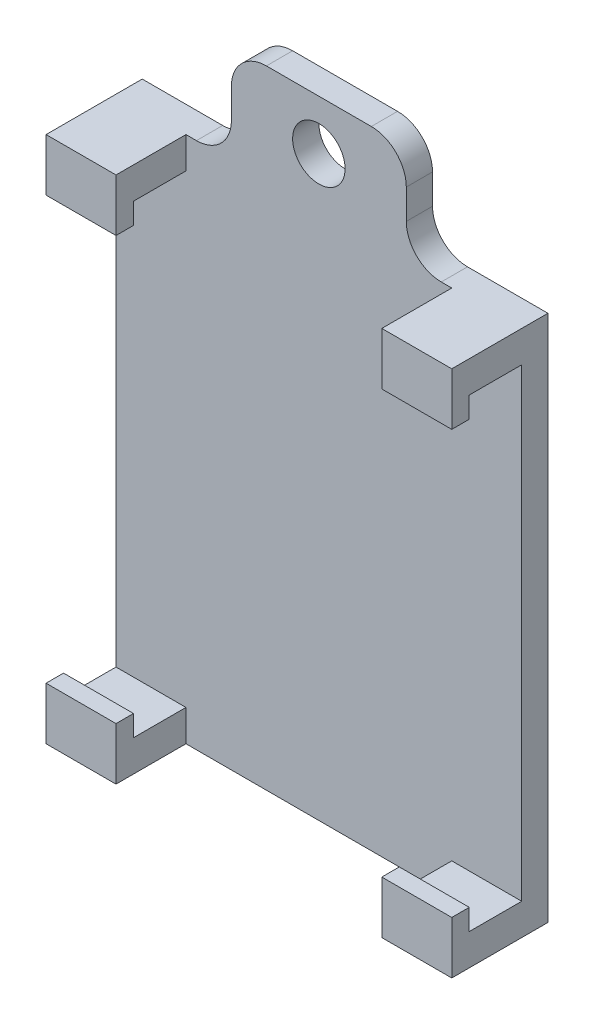
ISO-10303-21;
HEADER;
FILE_DESCRIPTION(('STEP AP214'),'2;1');
FILE_NAME('part.step','',(''),(''),'','','');
FILE_SCHEMA(('AUTOMOTIVE_DESIGN { 1 0 10303 214 1 1 1 1 }'));
ENDSEC;
DATA;
#1=APPLICATION_CONTEXT('core data for automotive mechanical design processes');
#2=APPLICATION_PROTOCOL_DEFINITION('international standard','automotive_design',2000,#1);
#3=PRODUCT_CONTEXT('',#1,'mechanical');
#4=PRODUCT('Part','Part','',(#3));
#5=PRODUCT_RELATED_PRODUCT_CATEGORY('part','',(#4));
#6=PRODUCT_DEFINITION_FORMATION('','',#4);
#7=PRODUCT_DEFINITION_CONTEXT('part definition',#1,'design');
#8=PRODUCT_DEFINITION('design','',#6,#7);
#9=PRODUCT_DEFINITION_SHAPE('','',#8);
#10=(LENGTH_UNIT() NAMED_UNIT(*) SI_UNIT(.MILLI.,.METRE.));
#11=(NAMED_UNIT(*) PLANE_ANGLE_UNIT() SI_UNIT($,.RADIAN.));
#12=(NAMED_UNIT(*) SI_UNIT($,.STERADIAN.) SOLID_ANGLE_UNIT());
#13=UNCERTAINTY_MEASURE_WITH_UNIT(LENGTH_MEASURE(1.E-05),#10,'distance_accuracy_value','');
#14=(GEOMETRIC_REPRESENTATION_CONTEXT(3) GLOBAL_UNCERTAINTY_ASSIGNED_CONTEXT((#13)) GLOBAL_UNIT_ASSIGNED_CONTEXT((#10,
#11,#12)) REPRESENTATION_CONTEXT('',''));
#15=CARTESIAN_POINT('',(0.,0.,0.));
#16=DIRECTION('',(0.,0.,1.));
#17=DIRECTION('',(1.,0.,0.));
#18=AXIS2_PLACEMENT_3D('',#15,#16,#17);
#19=CARTESIAN_POINT('',(0.,14.92,-17.95));
#20=DIRECTION('',(0.,1.,0.));
#21=DIRECTION('',(-1.,0.,0.));
#22=AXIS2_PLACEMENT_3D('',#19,#20,#21);
#23=PLANE('',#22);
#24=DIRECTION('',(-1.,0.,0.));
#25=VECTOR('',#24,1.);
#26=CARTESIAN_POINT('',(0.,14.92,-18.95));
#27=LINE('',#26,#25);
#28=CARTESIAN_POINT('',(4.,14.92,-18.95));
#29=VERTEX_POINT('',#28);
#30=CARTESIAN_POINT('',(0.,14.92,-18.95));
#31=VERTEX_POINT('',#30);
#32=EDGE_CURVE('E446',#29,#31,#27,.T.);
#33=ORIENTED_EDGE('',*,*,#32,.F.);
#34=DIRECTION('',(0.,0.,1.));
#35=VECTOR('',#34,1.);
#36=CARTESIAN_POINT('',(4.,14.92,-17.95));
#37=LINE('',#36,#35);
#38=CARTESIAN_POINT('',(4.,14.92,-17.95));
#39=VERTEX_POINT('',#38);
#40=EDGE_CURVE('E412',#29,#39,#37,.T.);
#41=ORIENTED_EDGE('',*,*,#40,.T.);
#42=DIRECTION('',(1.,0.,0.));
#43=VECTOR('',#42,1.);
#44=CARTESIAN_POINT('',(0.,14.92,-17.95));
#45=LINE('',#44,#43);
#46=CARTESIAN_POINT('',(0.,14.92,-17.95));
#47=VERTEX_POINT('',#46);
#48=EDGE_CURVE('E494',#47,#39,#45,.T.);
#49=ORIENTED_EDGE('',*,*,#48,.F.);
#50=DIRECTION('',(0.,0.,-1.));
#51=VECTOR('',#50,1.);
#52=CARTESIAN_POINT('',(0.,14.92,-17.95));
#53=LINE('',#52,#51);
#54=EDGE_CURVE('E282',#47,#31,#53,.T.);
#55=ORIENTED_EDGE('',*,*,#54,.T.);
#56=EDGE_LOOP('',(#33,#41,#49,#55));
#57=FACE_BOUND('',#56,.T.);
#58=ADVANCED_FACE('F40',(#57),#23,.F.);
#59=CARTESIAN_POINT('',(0.,17.92,-17.95));
#60=DIRECTION('',(0.,-1.,0.));
#61=DIRECTION('',(1.,0.,0.));
#62=AXIS2_PLACEMENT_3D('',#59,#60,#61);
#63=PLANE('',#62);
#64=DIRECTION('',(1.,0.,0.));
#65=VECTOR('',#64,1.);
#66=CARTESIAN_POINT('',(0.,17.92,-21.9499999999999));
#67=LINE('',#66,#65);
#68=CARTESIAN_POINT('',(4.,17.92,-21.9499999999999));
#69=VERTEX_POINT('',#68);
#70=CARTESIAN_POINT('',(4.6,17.92,-21.9499999999999));
#71=VERTEX_POINT('',#70);
#72=EDGE_CURVE('E354',#69,#71,#67,.T.);
#73=ORIENTED_EDGE('',*,*,#72,.T.);
#74=DIRECTION('',(0.,0.,1.));
#75=VECTOR('',#74,1.);
#76=CARTESIAN_POINT('',(4.6,17.92,-23.4499999999999));
#77=LINE('',#76,#75);
#78=CARTESIAN_POINT('',(4.6,17.92,-23.4499999999999));
#79=VERTEX_POINT('',#78);
#80=EDGE_CURVE('E269',#71,#79,#77,.F.);
#81=ORIENTED_EDGE('',*,*,#80,.T.);
#82=DIRECTION('',(1.,0.,0.));
#83=VECTOR('',#82,1.);
#84=CARTESIAN_POINT('',(0.,17.92,-23.4499999999999));
#85=LINE('',#84,#83);
#86=CARTESIAN_POINT('',(0.,17.92,-23.4499999999999));
#87=VERTEX_POINT('',#86);
#88=EDGE_CURVE('E265',#87,#79,#85,.T.);
#89=ORIENTED_EDGE('',*,*,#88,.F.);
#90=DIRECTION('',(0.,0.,-1.));
#91=VECTOR('',#90,1.);
#92=CARTESIAN_POINT('',(0.,17.92,-17.95));
#93=LINE('',#92,#91);
#94=CARTESIAN_POINT('',(0.,17.92,-17.95));
#95=VERTEX_POINT('',#94);
#96=EDGE_CURVE('E249',#95,#87,#93,.T.);
#97=ORIENTED_EDGE('',*,*,#96,.F.);
#98=DIRECTION('',(-1.,0.,0.));
#99=VECTOR('',#98,1.);
#100=CARTESIAN_POINT('',(0.,17.92,-17.95));
#101=LINE('',#100,#99);
#102=CARTESIAN_POINT('',(4.,17.92,-17.95));
#103=VERTEX_POINT('',#102);
#104=EDGE_CURVE('E499',#103,#95,#101,.T.);
#105=ORIENTED_EDGE('',*,*,#104,.F.);
#106=DIRECTION('',(0.,0.,-1.));
#107=VECTOR('',#106,1.);
#108=CARTESIAN_POINT('',(4.,17.92,-17.9499999999999));
#109=LINE('',#108,#107);
#110=EDGE_CURVE('E415',#103,#69,#109,.T.);
#111=ORIENTED_EDGE('',*,*,#110,.T.);
#112=EDGE_LOOP('',(#73,#81,#89,#97,#105,#111));
#113=FACE_BOUND('',#112,.T.);
#114=ADVANCED_FACE('F267',(#113),#63,.F.);
#115=CARTESIAN_POINT('',(0.,-17.95,-17.9500000000001));
#116=DIRECTION('',(0.,0.,-1.));
#117=DIRECTION('',(0.,1.,0.));
#118=AXIS2_PLACEMENT_3D('',#115,#116,#117);
#119=PLANE('',#118);
#120=ORIENTED_EDGE('',*,*,#48,.T.);
#121=DIRECTION('',(0.,-1.,0.));
#122=VECTOR('',#121,1.);
#123=CARTESIAN_POINT('',(4.,23.62,-17.9499999999999));
#124=LINE('',#123,#122);
#125=EDGE_CURVE('E373',#103,#39,#124,.T.);
#126=ORIENTED_EDGE('',*,*,#125,.F.);
#127=ORIENTED_EDGE('',*,*,#104,.T.);
#128=DIRECTION('',(0.,-1.,0.));
#129=VECTOR('',#128,1.);
#130=CARTESIAN_POINT('',(0.,14.92,-17.95));
#131=LINE('',#130,#129);
#132=EDGE_CURVE('E258',#95,#47,#131,.T.);
#133=ORIENTED_EDGE('',*,*,#132,.T.);
#134=EDGE_LOOP('',(#120,#126,#127,#133));
#135=FACE_BOUND('',#134,.T.);
#136=ADVANCED_FACE('F539',(#135),#119,.F.);
#137=CARTESIAN_POINT('',(0.,-9.25000000000001,-17.95));
#138=DIRECTION('',(0.,-1.,0.));
#139=DIRECTION('',(1.,0.,0.));
#140=AXIS2_PLACEMENT_3D('',#137,#138,#139);
#141=PLANE('',#140);
#142=DIRECTION('',(-1.,0.,0.));
#143=VECTOR('',#142,1.);
#144=CARTESIAN_POINT('',(0.,-9.25000000000001,-17.95));
#145=LINE('',#144,#143);
#146=CARTESIAN_POINT('',(4.,-9.25000000000001,-17.95));
#147=VERTEX_POINT('',#146);
#148=CARTESIAN_POINT('',(0.,-9.25000000000001,-17.95));
#149=VERTEX_POINT('',#148);
#150=EDGE_CURVE('E478',#147,#149,#145,.T.);
#151=ORIENTED_EDGE('',*,*,#150,.F.);
#152=DIRECTION('',(0.,0.,-1.));
#153=VECTOR('',#152,1.);
#154=CARTESIAN_POINT('',(4.,-9.25000000000001,-17.95));
#155=LINE('',#154,#153);
#156=CARTESIAN_POINT('',(4.,-9.25,-18.95));
#157=VERTEX_POINT('',#156);
#158=EDGE_CURVE('E403',#147,#157,#155,.T.);
#159=ORIENTED_EDGE('',*,*,#158,.T.);
#160=DIRECTION('',(1.,0.,0.));
#161=VECTOR('',#160,1.);
#162=CARTESIAN_POINT('',(23.2,-9.25,-18.95));
#163=LINE('',#162,#161);
#164=CARTESIAN_POINT('',(0.,-9.25,-18.95));
#165=VERTEX_POINT('',#164);
#166=EDGE_CURVE('E430',#165,#157,#163,.T.);
#167=ORIENTED_EDGE('',*,*,#166,.F.);
#168=DIRECTION('',(0.,0.,-1.));
#169=VECTOR('',#168,1.);
#170=CARTESIAN_POINT('',(0.,-9.25000000000001,-17.95));
#171=LINE('',#170,#169);
#172=EDGE_CURVE('E482',#149,#165,#171,.T.);
#173=ORIENTED_EDGE('',*,*,#172,.F.);
#174=EDGE_LOOP('',(#151,#159,#167,#173));
#175=FACE_BOUND('',#174,.T.);
#176=ADVANCED_FACE('F564',(#175),#141,.F.);
#177=CARTESIAN_POINT('',(0.,-17.95,-17.9500000000001));
#178=DIRECTION('',(0.,0.,1.));
#179=DIRECTION('',(0.,-1.,0.));
#180=AXIS2_PLACEMENT_3D('',#177,#178,#179);
#181=PLANE('',#180);
#182=CARTESIAN_POINT('',(4.,-12.25,-17.9500000000001));
#183=VERTEX_POINT('',#182);
#184=EDGE_CURVE('E371',#147,#183,#124,.T.);
#185=ORIENTED_EDGE('',*,*,#184,.F.);
#186=ORIENTED_EDGE('',*,*,#150,.T.);
#187=DIRECTION('',(0.,-1.,0.));
#188=VECTOR('',#187,1.);
#189=CARTESIAN_POINT('',(0.,-9.25000000000001,-17.95));
#190=LINE('',#189,#188);
#191=CARTESIAN_POINT('',(0.,-12.25,-17.9500000000001));
#192=VERTEX_POINT('',#191);
#193=EDGE_CURVE('E468',#149,#192,#190,.T.);
#194=ORIENTED_EDGE('',*,*,#193,.T.);
#195=DIRECTION('',(1.,0.,0.));
#196=VECTOR('',#195,1.);
#197=CARTESIAN_POINT('',(0.,-12.25,-17.9500000000001));
#198=LINE('',#197,#196);
#199=EDGE_CURVE('E473',#192,#183,#198,.T.);
#200=ORIENTED_EDGE('',*,*,#199,.T.);
#201=EDGE_LOOP('',(#185,#186,#194,#200));
#202=FACE_BOUND('',#201,.T.);
#203=ADVANCED_FACE('F568',(#202),#181,.T.);
#204=CARTESIAN_POINT('',(0.,16.12,-18.95));
#205=DIRECTION('',(0.,0.,1.));
#206=DIRECTION('',(0.,-1.,0.));
#207=AXIS2_PLACEMENT_3D('',#204,#205,#206);
#208=PLANE('',#207);
#209=DIRECTION('',(-1.,0.,0.));
#210=VECTOR('',#209,1.);
#211=CARTESIAN_POINT('',(0.,16.12,-18.95));
#212=LINE('',#211,#210);
#213=CARTESIAN_POINT('',(4.,16.12,-18.95));
#214=VERTEX_POINT('',#213);
#215=CARTESIAN_POINT('',(0.,16.12,-18.95));
#216=VERTEX_POINT('',#215);
#217=EDGE_CURVE('E458',#214,#216,#212,.T.);
#218=ORIENTED_EDGE('',*,*,#217,.F.);
#219=DIRECTION('',(0.,-1.,0.));
#220=VECTOR('',#219,1.);
#221=CARTESIAN_POINT('',(4.,16.12,-18.95));
#222=LINE('',#221,#220);
#223=EDGE_CURVE('E409',#214,#29,#222,.T.);
#224=ORIENTED_EDGE('',*,*,#223,.T.);
#225=ORIENTED_EDGE('',*,*,#32,.T.);
#226=DIRECTION('',(0.,-1.,0.));
#227=VECTOR('',#226,1.);
#228=CARTESIAN_POINT('',(0.,16.12,-18.95));
#229=LINE('',#228,#227);
#230=EDGE_CURVE('E465',#216,#31,#229,.T.);
#231=ORIENTED_EDGE('',*,*,#230,.F.);
#232=EDGE_LOOP('',(#218,#224,#225,#231));
#233=FACE_BOUND('',#232,.T.);
#234=ADVANCED_FACE('F544',(#233),#208,.F.);
#235=CARTESIAN_POINT('',(0.,16.12,-23.45));
#236=DIRECTION('',(0.,1.,0.));
#237=DIRECTION('',(-1.,0.,0.));
#238=AXIS2_PLACEMENT_3D('',#235,#236,#237);
#239=PLANE('',#238);
#240=DIRECTION('',(1.,0.,0.));
#241=VECTOR('',#240,1.);
#242=CARTESIAN_POINT('',(0.,16.12,-21.95));
#243=LINE('',#242,#241);
#244=CARTESIAN_POINT('',(0.,16.12,-21.95));
#245=VERTEX_POINT('',#244);
#246=CARTESIAN_POINT('',(4.,16.12,-21.95));
#247=VERTEX_POINT('',#246);
#248=EDGE_CURVE('E453',#245,#247,#243,.T.);
#249=ORIENTED_EDGE('',*,*,#248,.T.);
#250=DIRECTION('',(0.,0.,1.));
#251=VECTOR('',#250,1.);
#252=CARTESIAN_POINT('',(4.,16.12,-23.45));
#253=LINE('',#252,#251);
#254=EDGE_CURVE('E406',#247,#214,#253,.T.);
#255=ORIENTED_EDGE('',*,*,#254,.T.);
#256=ORIENTED_EDGE('',*,*,#217,.T.);
#257=DIRECTION('',(0.,0.,-1.));
#258=VECTOR('',#257,1.);
#259=CARTESIAN_POINT('',(0.,16.12,-21.95));
#260=LINE('',#259,#258);
#261=EDGE_CURVE('E448',#216,#245,#260,.T.);
#262=ORIENTED_EDGE('',*,*,#261,.T.);
#263=EDGE_LOOP('',(#249,#255,#256,#262));
#264=FACE_BOUND('',#263,.T.);
#265=ADVANCED_FACE('F548',(#264),#239,.F.);
#266=CARTESIAN_POINT('',(23.2,-10.45,-18.95));
#267=DIRECTION('',(0.,0.,1.));
#268=DIRECTION('',(0.,-1.,0.));
#269=AXIS2_PLACEMENT_3D('',#266,#267,#268);
#270=PLANE('',#269);
#271=ORIENTED_EDGE('',*,*,#166,.T.);
#272=DIRECTION('',(0.,-1.,0.));
#273=VECTOR('',#272,1.);
#274=CARTESIAN_POINT('',(4.,-10.45,-18.95));
#275=LINE('',#274,#273);
#276=CARTESIAN_POINT('',(4.,-10.45,-18.95));
#277=VERTEX_POINT('',#276);
#278=EDGE_CURVE('E400',#157,#277,#275,.T.);
#279=ORIENTED_EDGE('',*,*,#278,.T.);
#280=DIRECTION('',(1.,0.,0.));
#281=VECTOR('',#280,1.);
#282=CARTESIAN_POINT('',(23.2,-10.45,-18.95));
#283=LINE('',#282,#281);
#284=CARTESIAN_POINT('',(0.,-10.45,-18.95));
#285=VERTEX_POINT('',#284);
#286=EDGE_CURVE('E437',#285,#277,#283,.T.);
#287=ORIENTED_EDGE('',*,*,#286,.F.);
#288=DIRECTION('',(0.,1.,0.));
#289=VECTOR('',#288,1.);
#290=CARTESIAN_POINT('',(0.,-10.45,-18.95));
#291=LINE('',#290,#289);
#292=EDGE_CURVE('E440',#285,#165,#291,.T.);
#293=ORIENTED_EDGE('',*,*,#292,.T.);
#294=EDGE_LOOP('',(#271,#279,#287,#293));
#295=FACE_BOUND('',#294,.T.);
#296=ADVANCED_FACE('F557',(#295),#270,.F.);
#297=CARTESIAN_POINT('',(0.,-10.45,-23.45));
#298=DIRECTION('',(0.,-1.,0.));
#299=DIRECTION('',(1.,0.,0.));
#300=AXIS2_PLACEMENT_3D('',#297,#298,#299);
#301=PLANE('',#300);
#302=ORIENTED_EDGE('',*,*,#286,.T.);
#303=DIRECTION('',(0.,0.,-1.));
#304=VECTOR('',#303,1.);
#305=CARTESIAN_POINT('',(4.,-10.45,-23.45));
#306=LINE('',#305,#304);
#307=CARTESIAN_POINT('',(4.,-10.45,-21.95));
#308=VERTEX_POINT('',#307);
#309=EDGE_CURVE('E300',#277,#308,#306,.T.);
#310=ORIENTED_EDGE('',*,*,#309,.T.);
#311=DIRECTION('',(-1.,0.,0.));
#312=VECTOR('',#311,1.);
#313=CARTESIAN_POINT('',(23.2,-10.45,-21.95));
#314=LINE('',#313,#312);
#315=CARTESIAN_POINT('',(0.,-10.45,-21.95));
#316=VERTEX_POINT('',#315);
#317=EDGE_CURVE('E429',#308,#316,#314,.T.);
#318=ORIENTED_EDGE('',*,*,#317,.T.);
#319=DIRECTION('',(0.,0.,1.));
#320=VECTOR('',#319,1.);
#321=CARTESIAN_POINT('',(0.,-10.45,-21.95));
#322=LINE('',#321,#320);
#323=EDGE_CURVE('E434',#316,#285,#322,.T.);
#324=ORIENTED_EDGE('',*,*,#323,.T.);
#325=EDGE_LOOP('',(#302,#310,#318,#324));
#326=FACE_BOUND('',#325,.T.);
#327=ADVANCED_FACE('F555',(#326),#301,.F.);
#328=CARTESIAN_POINT('',(0.,-17.95,-21.9500000000001));
#329=DIRECTION('',(1.,0.,0.));
#330=DIRECTION('',(0.,1.,0.));
#331=AXIS2_PLACEMENT_3D('',#328,#329,#330);
#332=PLANE('',#331);
#333=ORIENTED_EDGE('',*,*,#96,.T.);
#334=DIRECTION('',(0.,-1.,0.));
#335=VECTOR('',#334,1.);
#336=CARTESIAN_POINT('',(0.,-17.95,-23.4500000000001));
#337=LINE('',#336,#335);
#338=CARTESIAN_POINT('',(0.,-12.25,-23.4500000000001));
#339=VERTEX_POINT('',#338);
#340=EDGE_CURVE('E254',#87,#339,#337,.T.);
#341=ORIENTED_EDGE('',*,*,#340,.T.);
#342=DIRECTION('',(0.,0.,-1.));
#343=VECTOR('',#342,1.);
#344=CARTESIAN_POINT('',(0.,-12.25,-17.9500000000001));
#345=LINE('',#344,#343);
#346=EDGE_CURVE('E490',#192,#339,#345,.T.);
#347=ORIENTED_EDGE('',*,*,#346,.F.);
#348=ORIENTED_EDGE('',*,*,#193,.F.);
#349=ORIENTED_EDGE('',*,*,#172,.T.);
#350=ORIENTED_EDGE('',*,*,#292,.F.);
#351=ORIENTED_EDGE('',*,*,#323,.F.);
#352=DIRECTION('',(0.,-1.,0.));
#353=VECTOR('',#352,1.);
#354=CARTESIAN_POINT('',(0.,-17.95,-21.9500000000001));
#355=LINE('',#354,#353);
#356=EDGE_CURVE('E296',#245,#316,#355,.T.);
#357=ORIENTED_EDGE('',*,*,#356,.F.);
#358=ORIENTED_EDGE('',*,*,#261,.F.);
#359=ORIENTED_EDGE('',*,*,#230,.T.);
#360=ORIENTED_EDGE('',*,*,#54,.F.);
#361=ORIENTED_EDGE('',*,*,#132,.F.);
#362=EDGE_LOOP('',(#333,#341,#347,#348,#349,#350,#351,#357,#358,#359,#360,#361));
#363=FACE_BOUND('',#362,.T.);
#364=ADVANCED_FACE('F251',(#363),#332,.F.);
#365=CARTESIAN_POINT('',(23.2,-17.95,-21.9500000000001));
#366=DIRECTION('',(-1.,0.,0.));
#367=DIRECTION('',(0.,-1.,0.));
#368=AXIS2_PLACEMENT_3D('',#365,#366,#367);
#369=PLANE('',#368);
#370=DIRECTION('',(0.,1.,0.));
#371=VECTOR('',#370,1.);
#372=CARTESIAN_POINT('',(23.2,-17.95,-23.4500000000001));
#373=LINE('',#372,#371);
#374=CARTESIAN_POINT('',(23.2,-12.25,-23.4500000000001));
#375=VERTEX_POINT('',#374);
#376=CARTESIAN_POINT('',(23.2,17.92,-23.4499999999999));
#377=VERTEX_POINT('',#376);
#378=EDGE_CURVE('E281',#375,#377,#373,.T.);
#379=ORIENTED_EDGE('',*,*,#378,.T.);
#380=DIRECTION('',(0.,0.,-1.));
#381=VECTOR('',#380,1.);
#382=CARTESIAN_POINT('',(23.2,17.92,-17.95));
#383=LINE('',#382,#381);
#384=CARTESIAN_POINT('',(23.2,17.92,-17.95));
#385=VERTEX_POINT('',#384);
#386=EDGE_CURVE('E261',#385,#377,#383,.T.);
#387=ORIENTED_EDGE('',*,*,#386,.F.);
#388=DIRECTION('',(0.,1.,0.));
#389=VECTOR('',#388,1.);
#390=CARTESIAN_POINT('',(23.2,14.92,-17.95));
#391=LINE('',#390,#389);
#392=CARTESIAN_POINT('',(23.2,14.92,-17.95));
#393=VERTEX_POINT('',#392);
#394=EDGE_CURVE('E497',#393,#385,#391,.T.);
#395=ORIENTED_EDGE('',*,*,#394,.F.);
#396=DIRECTION('',(0.,0.,-1.));
#397=VECTOR('',#396,1.);
#398=CARTESIAN_POINT('',(23.2,14.92,-17.95));
#399=LINE('',#398,#397);
#400=CARTESIAN_POINT('',(23.2,14.92,-18.95));
#401=VERTEX_POINT('',#400);
#402=EDGE_CURVE('E288',#393,#401,#399,.T.);
#403=ORIENTED_EDGE('',*,*,#402,.T.);
#404=DIRECTION('',(0.,-1.,0.));
#405=VECTOR('',#404,1.);
#406=CARTESIAN_POINT('',(23.2,16.12,-18.95));
#407=LINE('',#406,#405);
#408=CARTESIAN_POINT('',(23.2,16.12,-18.95));
#409=VERTEX_POINT('',#408);
#410=EDGE_CURVE('E462',#409,#401,#407,.T.);
#411=ORIENTED_EDGE('',*,*,#410,.F.);
#412=DIRECTION('',(0.,0.,1.));
#413=VECTOR('',#412,1.);
#414=CARTESIAN_POINT('',(23.2,16.12,-21.95));
#415=LINE('',#414,#413);
#416=CARTESIAN_POINT('',(23.2,16.12,-21.95));
#417=VERTEX_POINT('',#416);
#418=EDGE_CURVE('E456',#417,#409,#415,.T.);
#419=ORIENTED_EDGE('',*,*,#418,.F.);
#420=DIRECTION('',(0.,1.,0.));
#421=VECTOR('',#420,1.);
#422=CARTESIAN_POINT('',(23.2,-17.95,-21.9500000000001));
#423=LINE('',#422,#421);
#424=CARTESIAN_POINT('',(23.2,-10.45,-21.95));
#425=VERTEX_POINT('',#424);
#426=EDGE_CURVE('E506',#425,#417,#423,.T.);
#427=ORIENTED_EDGE('',*,*,#426,.F.);
#428=DIRECTION('',(0.,0.,-1.));
#429=VECTOR('',#428,1.);
#430=CARTESIAN_POINT('',(23.2,-10.45,-21.95));
#431=LINE('',#430,#429);
#432=CARTESIAN_POINT('',(23.2,-10.45,-18.95));
#433=VERTEX_POINT('',#432);
#434=EDGE_CURVE('E426',#433,#425,#431,.T.);
#435=ORIENTED_EDGE('',*,*,#434,.F.);
#436=DIRECTION('',(0.,1.,0.));
#437=VECTOR('',#436,1.);
#438=CARTESIAN_POINT('',(23.2,-10.45,-18.95));
#439=LINE('',#438,#437);
#440=CARTESIAN_POINT('',(23.2,-9.25,-18.95));
#441=VERTEX_POINT('',#440);
#442=EDGE_CURVE('E443',#433,#441,#439,.T.);
#443=ORIENTED_EDGE('',*,*,#442,.T.);
#444=DIRECTION('',(0.,0.,-1.));
#445=VECTOR('',#444,1.);
#446=CARTESIAN_POINT('',(23.2,-9.25000000000001,-17.95));
#447=LINE('',#446,#445);
#448=CARTESIAN_POINT('',(23.2,-9.25000000000001,-17.95));
#449=VERTEX_POINT('',#448);
#450=EDGE_CURVE('E485',#449,#441,#447,.T.);
#451=ORIENTED_EDGE('',*,*,#450,.F.);
#452=DIRECTION('',(0.,1.,0.));
#453=VECTOR('',#452,1.);
#454=CARTESIAN_POINT('',(23.2,-9.25000000000001,-17.95));
#455=LINE('',#454,#453);
#456=CARTESIAN_POINT('',(23.2,-12.25,-17.9500000000001));
#457=VERTEX_POINT('',#456);
#458=EDGE_CURVE('E476',#457,#449,#455,.T.);
#459=ORIENTED_EDGE('',*,*,#458,.F.);
#460=DIRECTION('',(0.,0.,-1.));
#461=VECTOR('',#460,1.);
#462=CARTESIAN_POINT('',(23.2,-12.25,-17.9500000000001));
#463=LINE('',#462,#461);
#464=EDGE_CURVE('E488',#457,#375,#463,.T.);
#465=ORIENTED_EDGE('',*,*,#464,.T.);
#466=EDGE_LOOP('',(#379,#387,#395,#403,#411,#419,#427,#435,#443,#451,#459,#465));
#467=FACE_BOUND('',#466,.T.);
#468=ADVANCED_FACE('F584',(#467),#369,.F.);
#469=CARTESIAN_POINT('',(0.,-17.95,-23.4500000000001));
#470=DIRECTION('',(0.,0.,-1.));
#471=DIRECTION('',(0.,1.,0.));
#472=AXIS2_PLACEMENT_3D('',#469,#470,#471);
#473=PLANE('',#472);
#474=DIRECTION('',(0.,1.,0.));
#475=VECTOR('',#474,1.);
#476=CARTESIAN_POINT('',(6.6,23.62,-23.4499999999999));
#477=LINE('',#476,#475);
#478=CARTESIAN_POINT('',(6.6,19.92,-23.4499999999999));
#479=VERTEX_POINT('',#478);
#480=CARTESIAN_POINT('',(6.6,21.62,-23.4499999999999));
#481=VERTEX_POINT('',#480);
#482=EDGE_CURVE('E271',#479,#481,#477,.T.);
#483=ORIENTED_EDGE('',*,*,#482,.T.);
#484=CARTESIAN_POINT('',(8.6,21.62,-23.4499999999999));
#485=DIRECTION('',(0.,0.,-1.));
#486=DIRECTION('',(0.,1.,0.));
#487=AXIS2_PLACEMENT_3D('',#484,#485,#486);
#488=CIRCLE('',#487,2.);
#489=CARTESIAN_POINT('',(8.6,23.62,-23.4499999999999));
#490=VERTEX_POINT('',#489);
#491=EDGE_CURVE('E320',#481,#490,#488,.T.);
#492=ORIENTED_EDGE('',*,*,#491,.T.);
#493=DIRECTION('',(-1.,0.,0.));
#494=VECTOR('',#493,1.);
#495=CARTESIAN_POINT('',(0.,23.62,-23.4499999999999));
#496=LINE('',#495,#494);
#497=CARTESIAN_POINT('',(14.6,23.62,-23.4499999999999));
#498=VERTEX_POINT('',#497);
#499=EDGE_CURVE('E285',#498,#490,#496,.T.);
#500=ORIENTED_EDGE('',*,*,#499,.F.);
#501=CARTESIAN_POINT('',(14.6,21.62,-23.4499999999999));
#502=DIRECTION('',(0.,0.,-1.));
#503=DIRECTION('',(0.,1.,0.));
#504=AXIS2_PLACEMENT_3D('',#501,#502,#503);
#505=CIRCLE('',#504,2.);
#506=CARTESIAN_POINT('',(16.6,21.62,-23.4499999999999));
#507=VERTEX_POINT('',#506);
#508=EDGE_CURVE('E318',#498,#507,#505,.T.);
#509=ORIENTED_EDGE('',*,*,#508,.T.);
#510=DIRECTION('',(0.,-1.,0.));
#511=VECTOR('',#510,1.);
#512=CARTESIAN_POINT('',(16.6,23.62,-23.4499999999999));
#513=LINE('',#512,#511);
#514=CARTESIAN_POINT('',(16.6,19.92,-23.4499999999999));
#515=VERTEX_POINT('',#514);
#516=EDGE_CURVE('E355',#507,#515,#513,.T.);
#517=ORIENTED_EDGE('',*,*,#516,.T.);
#518=CARTESIAN_POINT('',(18.6,19.92,-23.4499999999999));
#519=DIRECTION('',(0.,0.,-1.));
#520=DIRECTION('',(0.,1.,0.));
#521=AXIS2_PLACEMENT_3D('',#518,#519,#520);
#522=CIRCLE('',#521,2.);
#523=CARTESIAN_POINT('',(18.6,17.92,-23.4499999999999));
#524=VERTEX_POINT('',#523);
#525=EDGE_CURVE('E12',#515,#524,#522,.F.);
#526=ORIENTED_EDGE('',*,*,#525,.T.);
#527=DIRECTION('',(1.,0.,0.));
#528=VECTOR('',#527,1.);
#529=CARTESIAN_POINT('',(23.2,17.92,-23.4499999999999));
#530=LINE('',#529,#528);
#531=EDGE_CURVE('E351',#524,#377,#530,.T.);
#532=ORIENTED_EDGE('',*,*,#531,.T.);
#533=ORIENTED_EDGE('',*,*,#378,.F.);
#534=DIRECTION('',(-1.,0.,0.));
#535=VECTOR('',#534,1.);
#536=CARTESIAN_POINT('',(0.,-12.25,-23.4500000000001));
#537=LINE('',#536,#535);
#538=EDGE_CURVE('E280',#375,#339,#537,.T.);
#539=ORIENTED_EDGE('',*,*,#538,.T.);
#540=ORIENTED_EDGE('',*,*,#340,.F.);
#541=ORIENTED_EDGE('',*,*,#88,.T.);
#542=CARTESIAN_POINT('',(4.6,19.92,-23.4499999999999));
#543=DIRECTION('',(0.,0.,-1.));
#544=DIRECTION('',(0.,1.,0.));
#545=AXIS2_PLACEMENT_3D('',#542,#543,#544);
#546=CIRCLE('',#545,2.);
#547=EDGE_CURVE('E331',#79,#479,#546,.F.);
#548=ORIENTED_EDGE('',*,*,#547,.T.);
#549=EDGE_LOOP('',(#483,#492,#500,#509,#517,#526,#532,#533,#539,#540,#541,#548));
#550=FACE_BOUND('',#549,.T.);
#551=CARTESIAN_POINT('',(11.6,20.77,-23.4499999999999));
#552=DIRECTION('',(0.,0.,1.));
#553=DIRECTION('',(0.,-1.,0.));
#554=AXIS2_PLACEMENT_3D('',#551,#552,#553);
#555=CIRCLE('',#554,1.5);
#556=CARTESIAN_POINT('',(11.6,19.27,-23.4499999999999));
#557=VERTEX_POINT('',#556);
#558=EDGE_CURVE('E420',#557,#557,#555,.T.);
#559=ORIENTED_EDGE('',*,*,#558,.T.);
#560=EDGE_LOOP('',(#559));
#561=FACE_BOUND('',#560,.T.);
#562=ADVANCED_FACE('F276',(#550,#561),#473,.T.);
#563=CARTESIAN_POINT('',(0.,-17.95,-21.9500000000001));
#564=DIRECTION('',(0.,0.,-1.));
#565=DIRECTION('',(0.,1.,0.));
#566=AXIS2_PLACEMENT_3D('',#563,#564,#565);
#567=PLANE('',#566);
#568=DIRECTION('',(-1.,0.,0.));
#569=VECTOR('',#568,1.);
#570=CARTESIAN_POINT('',(0.,23.62,-21.9499999999999));
#571=LINE('',#570,#569);
#572=CARTESIAN_POINT('',(14.6,23.62,-21.9499999999999));
#573=VERTEX_POINT('',#572);
#574=CARTESIAN_POINT('',(8.6,23.62,-21.9499999999999));
#575=VERTEX_POINT('',#574);
#576=EDGE_CURVE('E291',#573,#575,#571,.T.);
#577=ORIENTED_EDGE('',*,*,#576,.T.);
#578=CARTESIAN_POINT('',(8.6,21.62,-21.9499999999999));
#579=DIRECTION('',(0.,0.,-1.));
#580=DIRECTION('',(0.,1.,0.));
#581=AXIS2_PLACEMENT_3D('',#578,#579,#580);
#582=CIRCLE('',#581,2.);
#583=CARTESIAN_POINT('',(6.6,21.62,-21.9499999999999));
#584=VERTEX_POINT('',#583);
#585=EDGE_CURVE('E316',#575,#584,#582,.F.);
#586=ORIENTED_EDGE('',*,*,#585,.T.);
#587=DIRECTION('',(0.,1.,0.));
#588=VECTOR('',#587,1.);
#589=CARTESIAN_POINT('',(6.6,23.62,-21.9499999999999));
#590=LINE('',#589,#588);
#591=CARTESIAN_POINT('',(6.6,19.92,-21.9499999999999));
#592=VERTEX_POINT('',#591);
#593=EDGE_CURVE('E272',#592,#584,#590,.T.);
#594=ORIENTED_EDGE('',*,*,#593,.F.);
#595=CARTESIAN_POINT('',(4.6,19.92,-21.9499999999999));
#596=DIRECTION('',(0.,0.,-1.));
#597=DIRECTION('',(0.,1.,0.));
#598=AXIS2_PLACEMENT_3D('',#595,#596,#597);
#599=CIRCLE('',#598,2.);
#600=EDGE_CURVE('E329',#592,#71,#599,.T.);
#601=ORIENTED_EDGE('',*,*,#600,.T.);
#602=ORIENTED_EDGE('',*,*,#72,.F.);
#603=DIRECTION('',(0.,-1.,0.));
#604=VECTOR('',#603,1.);
#605=CARTESIAN_POINT('',(4.,23.62,-21.9499999999999));
#606=LINE('',#605,#604);
#607=EDGE_CURVE('E381',#69,#247,#606,.T.);
#608=ORIENTED_EDGE('',*,*,#607,.T.);
#609=ORIENTED_EDGE('',*,*,#248,.F.);
#610=ORIENTED_EDGE('',*,*,#356,.T.);
#611=ORIENTED_EDGE('',*,*,#317,.F.);
#612=CARTESIAN_POINT('',(4.,-12.25,-21.9500000000001));
#613=VERTEX_POINT('',#612);
#614=EDGE_CURVE('E370',#308,#613,#606,.T.);
#615=ORIENTED_EDGE('',*,*,#614,.T.);
#616=DIRECTION('',(1.,0.,0.));
#617=VECTOR('',#616,1.);
#618=CARTESIAN_POINT('',(4.,-12.25,-21.9500000000001));
#619=LINE('',#618,#617);
#620=CARTESIAN_POINT('',(19.2,-12.25,-21.9500000000001));
#621=VERTEX_POINT('',#620);
#622=EDGE_CURVE('E365',#613,#621,#619,.T.);
#623=ORIENTED_EDGE('',*,*,#622,.T.);
#624=DIRECTION('',(0.,-1.,0.));
#625=VECTOR('',#624,1.);
#626=CARTESIAN_POINT('',(19.2,23.62,-21.9499999999999));
#627=LINE('',#626,#625);
#628=CARTESIAN_POINT('',(19.2,-10.45,-21.95));
#629=VERTEX_POINT('',#628);
#630=EDGE_CURVE('E379',#629,#621,#627,.T.);
#631=ORIENTED_EDGE('',*,*,#630,.F.);
#632=EDGE_CURVE('E431',#425,#629,#314,.T.);
#633=ORIENTED_EDGE('',*,*,#632,.F.);
#634=ORIENTED_EDGE('',*,*,#426,.T.);
#635=CARTESIAN_POINT('',(19.2,16.12,-21.95));
#636=VERTEX_POINT('',#635);
#637=EDGE_CURVE('E451',#636,#417,#243,.T.);
#638=ORIENTED_EDGE('',*,*,#637,.F.);
#639=CARTESIAN_POINT('',(19.2,17.92,-21.9499999999999));
#640=VERTEX_POINT('',#639);
#641=EDGE_CURVE('E378',#640,#636,#627,.T.);
#642=ORIENTED_EDGE('',*,*,#641,.F.);
#643=DIRECTION('',(1.,0.,0.));
#644=VECTOR('',#643,1.);
#645=CARTESIAN_POINT('',(23.2,17.92,-21.9499999999999));
#646=LINE('',#645,#644);
#647=CARTESIAN_POINT('',(18.6,17.92,-21.9499999999999));
#648=VERTEX_POINT('',#647);
#649=EDGE_CURVE('E340',#648,#640,#646,.T.);
#650=ORIENTED_EDGE('',*,*,#649,.F.);
#651=CARTESIAN_POINT('',(18.6,19.92,-21.9499999999999));
#652=DIRECTION('',(0.,0.,-1.));
#653=DIRECTION('',(0.,1.,0.));
#654=AXIS2_PLACEMENT_3D('',#651,#652,#653);
#655=CIRCLE('',#654,2.);
#656=CARTESIAN_POINT('',(16.6,19.92,-21.9499999999999));
#657=VERTEX_POINT('',#656);
#658=EDGE_CURVE('E48',#648,#657,#655,.T.);
#659=ORIENTED_EDGE('',*,*,#658,.T.);
#660=DIRECTION('',(0.,-1.,0.));
#661=VECTOR('',#660,1.);
#662=CARTESIAN_POINT('',(16.6,23.62,-21.9499999999999));
#663=LINE('',#662,#661);
#664=CARTESIAN_POINT('',(16.6,21.62,-21.9499999999999));
#665=VERTEX_POINT('',#664);
#666=EDGE_CURVE('E338',#665,#657,#663,.T.);
#667=ORIENTED_EDGE('',*,*,#666,.F.);
#668=CARTESIAN_POINT('',(14.6,21.62,-21.9499999999999));
#669=DIRECTION('',(0.,0.,-1.));
#670=DIRECTION('',(0.,1.,0.));
#671=AXIS2_PLACEMENT_3D('',#668,#669,#670);
#672=CIRCLE('',#671,2.);
#673=EDGE_CURVE('E314',#665,#573,#672,.F.);
#674=ORIENTED_EDGE('',*,*,#673,.T.);
#675=EDGE_LOOP('',(#577,#586,#594,#601,#602,#608,#609,#610,#611,#615,#623,#631,#633,#634,#638,
#642,#650,#659,#667,#674));
#676=FACE_BOUND('',#675,.T.);
#677=CARTESIAN_POINT('',(11.6,20.77,-21.9499999999999));
#678=DIRECTION('',(0.,0.,1.));
#679=DIRECTION('',(0.,-1.,0.));
#680=AXIS2_PLACEMENT_3D('',#677,#678,#679);
#681=CIRCLE('',#680,1.5);
#682=CARTESIAN_POINT('',(11.6,19.27,-21.9499999999999));
#683=VERTEX_POINT('',#682);
#684=EDGE_CURVE('E419',#683,#683,#681,.T.);
#685=ORIENTED_EDGE('',*,*,#684,.F.);
#686=EDGE_LOOP('',(#685));
#687=FACE_BOUND('',#686,.T.);
#688=ADVANCED_FACE('F336',(#676,#687),#567,.F.);
#689=CARTESIAN_POINT('',(0.,23.62,-21.9499999999999));
#690=DIRECTION('',(0.,-1.,0.));
#691=DIRECTION('',(1.,0.,0.));
#692=AXIS2_PLACEMENT_3D('',#689,#690,#691);
#693=PLANE('',#692);
#694=ORIENTED_EDGE('',*,*,#499,.T.);
#695=DIRECTION('',(0.,0.,1.));
#696=VECTOR('',#695,1.);
#697=CARTESIAN_POINT('',(8.6,23.62,-21.9499999999999));
#698=LINE('',#697,#696);
#699=EDGE_CURVE('E311',#490,#575,#698,.T.);
#700=ORIENTED_EDGE('',*,*,#699,.T.);
#701=ORIENTED_EDGE('',*,*,#576,.F.);
#702=DIRECTION('',(0.,0.,1.));
#703=VECTOR('',#702,1.);
#704=CARTESIAN_POINT('',(14.6,23.62,-21.9499999999999));
#705=LINE('',#704,#703);
#706=EDGE_CURVE('E309',#573,#498,#705,.F.);
#707=ORIENTED_EDGE('',*,*,#706,.T.);
#708=EDGE_LOOP('',(#694,#700,#701,#707));
#709=FACE_BOUND('',#708,.T.);
#710=ADVANCED_FACE('F516',(#709),#693,.F.);
#711=CARTESIAN_POINT('',(19.2,14.92,-17.95));
#712=VERTEX_POINT('',#711);
#713=EDGE_CURVE('E493',#712,#393,#45,.T.);
#714=ORIENTED_EDGE('',*,*,#713,.F.);
#715=DIRECTION('',(0.,0.,-1.));
#716=VECTOR('',#715,1.);
#717=CARTESIAN_POINT('',(19.2,14.92,-17.95));
#718=LINE('',#717,#716);
#719=CARTESIAN_POINT('',(19.2,14.92,-18.95));
#720=VERTEX_POINT('',#719);
#721=EDGE_CURVE('E395',#712,#720,#718,.T.);
#722=ORIENTED_EDGE('',*,*,#721,.T.);
#723=EDGE_CURVE('E452',#401,#720,#27,.T.);
#724=ORIENTED_EDGE('',*,*,#723,.F.);
#725=ORIENTED_EDGE('',*,*,#402,.F.);
#726=EDGE_LOOP('',(#714,#722,#724,#725));
#727=FACE_BOUND('',#726,.T.);
#728=ADVANCED_FACE('F598',(#727),#23,.F.);
#729=ORIENTED_EDGE('',*,*,#531,.F.);
#730=DIRECTION('',(0.,0.,1.));
#731=VECTOR('',#730,1.);
#732=CARTESIAN_POINT('',(18.6,17.92,-21.9499999999999));
#733=LINE('',#732,#731);
#734=EDGE_CURVE('E326',#524,#648,#733,.T.);
#735=ORIENTED_EDGE('',*,*,#734,.T.);
#736=ORIENTED_EDGE('',*,*,#649,.T.);
#737=DIRECTION('',(0.,0.,1.));
#738=VECTOR('',#737,1.);
#739=CARTESIAN_POINT('',(19.2,17.92,-17.95));
#740=LINE('',#739,#738);
#741=CARTESIAN_POINT('',(19.2,17.92,-17.9499999999999));
#742=VERTEX_POINT('',#741);
#743=EDGE_CURVE('E398',#640,#742,#740,.T.);
#744=ORIENTED_EDGE('',*,*,#743,.T.);
#745=EDGE_CURVE('E262',#385,#742,#101,.T.);
#746=ORIENTED_EDGE('',*,*,#745,.F.);
#747=ORIENTED_EDGE('',*,*,#386,.T.);
#748=EDGE_LOOP('',(#729,#735,#736,#744,#746,#747));
#749=FACE_BOUND('',#748,.T.);
#750=ADVANCED_FACE('F347',(#749),#63,.F.);
#751=ORIENTED_EDGE('',*,*,#745,.T.);
#752=DIRECTION('',(0.,-1.,0.));
#753=VECTOR('',#752,1.);
#754=CARTESIAN_POINT('',(19.2,23.62,-17.9499999999999));
#755=LINE('',#754,#753);
#756=EDGE_CURVE('E374',#742,#712,#755,.T.);
#757=ORIENTED_EDGE('',*,*,#756,.T.);
#758=ORIENTED_EDGE('',*,*,#713,.T.);
#759=ORIENTED_EDGE('',*,*,#394,.T.);
#760=EDGE_LOOP('',(#751,#757,#758,#759));
#761=FACE_BOUND('',#760,.T.);
#762=ADVANCED_FACE('F602',(#761),#119,.F.);
#763=CARTESIAN_POINT('',(0.,-12.25,-17.9500000000001));
#764=DIRECTION('',(0.,1.,0.));
#765=DIRECTION('',(-1.,0.,0.));
#766=AXIS2_PLACEMENT_3D('',#763,#764,#765);
#767=PLANE('',#766);
#768=ORIENTED_EDGE('',*,*,#622,.F.);
#769=DIRECTION('',(0.,0.,-1.));
#770=VECTOR('',#769,1.);
#771=CARTESIAN_POINT('',(4.,-12.25,-17.9500000000001));
#772=LINE('',#771,#770);
#773=EDGE_CURVE('E362',#183,#613,#772,.T.);
#774=ORIENTED_EDGE('',*,*,#773,.F.);
#775=ORIENTED_EDGE('',*,*,#199,.F.);
#776=ORIENTED_EDGE('',*,*,#346,.T.);
#777=ORIENTED_EDGE('',*,*,#538,.F.);
#778=ORIENTED_EDGE('',*,*,#464,.F.);
#779=CARTESIAN_POINT('',(19.2,-12.25,-17.9500000000001));
#780=VERTEX_POINT('',#779);
#781=EDGE_CURVE('E472',#780,#457,#198,.T.);
#782=ORIENTED_EDGE('',*,*,#781,.F.);
#783=DIRECTION('',(0.,0.,1.));
#784=VECTOR('',#783,1.);
#785=CARTESIAN_POINT('',(19.2,-12.25,-17.9500000000001));
#786=LINE('',#785,#784);
#787=EDGE_CURVE('E368',#621,#780,#786,.T.);
#788=ORIENTED_EDGE('',*,*,#787,.F.);
#789=EDGE_LOOP('',(#768,#774,#775,#776,#777,#778,#782,#788));
#790=FACE_BOUND('',#789,.T.);
#791=ADVANCED_FACE('F572',(#790),#767,.F.);
#792=CARTESIAN_POINT('',(19.2,-9.25,-18.95));
#793=VERTEX_POINT('',#792);
#794=EDGE_CURVE('E423',#793,#441,#163,.T.);
#795=ORIENTED_EDGE('',*,*,#794,.F.);
#796=DIRECTION('',(0.,0.,1.));
#797=VECTOR('',#796,1.);
#798=CARTESIAN_POINT('',(19.2,-9.25000000000001,-17.95));
#799=LINE('',#798,#797);
#800=CARTESIAN_POINT('',(19.2,-9.25000000000001,-17.95));
#801=VERTEX_POINT('',#800);
#802=EDGE_CURVE('E386',#793,#801,#799,.T.);
#803=ORIENTED_EDGE('',*,*,#802,.T.);
#804=EDGE_CURVE('E479',#449,#801,#145,.T.);
#805=ORIENTED_EDGE('',*,*,#804,.F.);
#806=ORIENTED_EDGE('',*,*,#450,.T.);
#807=EDGE_LOOP('',(#795,#803,#805,#806));
#808=FACE_BOUND('',#807,.T.);
#809=ADVANCED_FACE('F610',(#808),#141,.F.);
#810=EDGE_CURVE('E375',#801,#780,#755,.T.);
#811=ORIENTED_EDGE('',*,*,#810,.T.);
#812=ORIENTED_EDGE('',*,*,#781,.T.);
#813=ORIENTED_EDGE('',*,*,#458,.T.);
#814=ORIENTED_EDGE('',*,*,#804,.T.);
#815=EDGE_LOOP('',(#811,#812,#813,#814));
#816=FACE_BOUND('',#815,.T.);
#817=ADVANCED_FACE('F606',(#816),#181,.T.);
#818=ORIENTED_EDGE('',*,*,#723,.T.);
#819=DIRECTION('',(0.,1.,0.));
#820=VECTOR('',#819,1.);
#821=CARTESIAN_POINT('',(19.2,16.12,-18.95));
#822=LINE('',#821,#820);
#823=CARTESIAN_POINT('',(19.2,16.12,-18.95));
#824=VERTEX_POINT('',#823);
#825=EDGE_CURVE('E392',#720,#824,#822,.T.);
#826=ORIENTED_EDGE('',*,*,#825,.T.);
#827=EDGE_CURVE('E459',#409,#824,#212,.T.);
#828=ORIENTED_EDGE('',*,*,#827,.F.);
#829=ORIENTED_EDGE('',*,*,#410,.T.);
#830=EDGE_LOOP('',(#818,#826,#828,#829));
#831=FACE_BOUND('',#830,.T.);
#832=ADVANCED_FACE('F591',(#831),#208,.F.);
#833=ORIENTED_EDGE('',*,*,#827,.T.);
#834=DIRECTION('',(0.,0.,-1.));
#835=VECTOR('',#834,1.);
#836=CARTESIAN_POINT('',(19.2,16.12,-23.45));
#837=LINE('',#836,#835);
#838=EDGE_CURVE('E389',#824,#636,#837,.T.);
#839=ORIENTED_EDGE('',*,*,#838,.T.);
#840=ORIENTED_EDGE('',*,*,#637,.T.);
#841=ORIENTED_EDGE('',*,*,#418,.T.);
#842=EDGE_LOOP('',(#833,#839,#840,#841));
#843=FACE_BOUND('',#842,.T.);
#844=ADVANCED_FACE('F589',(#843),#239,.F.);
#845=CARTESIAN_POINT('',(19.2,-10.45,-18.95));
#846=VERTEX_POINT('',#845);
#847=EDGE_CURVE('E436',#846,#433,#283,.T.);
#848=ORIENTED_EDGE('',*,*,#847,.F.);
#849=DIRECTION('',(0.,1.,0.));
#850=VECTOR('',#849,1.);
#851=CARTESIAN_POINT('',(19.2,-10.45,-18.95));
#852=LINE('',#851,#850);
#853=EDGE_CURVE('E383',#846,#793,#852,.T.);
#854=ORIENTED_EDGE('',*,*,#853,.T.);
#855=ORIENTED_EDGE('',*,*,#794,.T.);
#856=ORIENTED_EDGE('',*,*,#442,.F.);
#857=EDGE_LOOP('',(#848,#854,#855,#856));
#858=FACE_BOUND('',#857,.T.);
#859=ADVANCED_FACE('F612',(#858),#270,.F.);
#860=ORIENTED_EDGE('',*,*,#632,.T.);
#861=DIRECTION('',(0.,0.,1.));
#862=VECTOR('',#861,1.);
#863=CARTESIAN_POINT('',(19.2,-10.45,-23.45));
#864=LINE('',#863,#862);
#865=EDGE_CURVE('E297',#629,#846,#864,.T.);
#866=ORIENTED_EDGE('',*,*,#865,.T.);
#867=ORIENTED_EDGE('',*,*,#847,.T.);
#868=ORIENTED_EDGE('',*,*,#434,.T.);
#869=EDGE_LOOP('',(#860,#866,#867,#868));
#870=FACE_BOUND('',#869,.T.);
#871=ADVANCED_FACE('F580',(#870),#301,.F.);
#872=CARTESIAN_POINT('',(11.6,20.77,-23.4499999999999));
#873=DIRECTION('',(0.,0.,1.));
#874=DIRECTION('',(0.,-1.,0.));
#875=AXIS2_PLACEMENT_3D('',#872,#873,#874);
#876=CYLINDRICAL_SURFACE('',#875,1.5);
#877=ORIENTED_EDGE('',*,*,#558,.F.);
#878=EDGE_LOOP('',(#877));
#879=FACE_BOUND('',#878,.T.);
#880=ORIENTED_EDGE('',*,*,#684,.T.);
#881=EDGE_LOOP('',(#880));
#882=FACE_BOUND('',#881,.T.);
#883=ADVANCED_FACE('F619',(#879,#882),#876,.F.);
#884=CARTESIAN_POINT('',(19.2,23.62,-17.9499999999999));
#885=DIRECTION('',(1.,0.,0.));
#886=DIRECTION('',(0.,1.,0.));
#887=AXIS2_PLACEMENT_3D('',#884,#885,#886);
#888=PLANE('',#887);
#889=ORIENTED_EDGE('',*,*,#853,.F.);
#890=ORIENTED_EDGE('',*,*,#865,.F.);
#891=ORIENTED_EDGE('',*,*,#630,.T.);
#892=ORIENTED_EDGE('',*,*,#787,.T.);
#893=ORIENTED_EDGE('',*,*,#810,.F.);
#894=ORIENTED_EDGE('',*,*,#802,.F.);
#895=EDGE_LOOP('',(#889,#890,#891,#892,#893,#894));
#896=FACE_BOUND('',#895,.T.);
#897=ADVANCED_FACE('F577',(#896),#888,.F.);
#898=CARTESIAN_POINT('',(4.,23.62,-17.9499999999999));
#899=DIRECTION('',(-1.,0.,0.));
#900=DIRECTION('',(0.,0.,-1.));
#901=AXIS2_PLACEMENT_3D('',#898,#899,#900);
#902=PLANE('',#901);
#903=ORIENTED_EDGE('',*,*,#184,.T.);
#904=ORIENTED_EDGE('',*,*,#773,.T.);
#905=ORIENTED_EDGE('',*,*,#614,.F.);
#906=ORIENTED_EDGE('',*,*,#309,.F.);
#907=ORIENTED_EDGE('',*,*,#278,.F.);
#908=ORIENTED_EDGE('',*,*,#158,.F.);
#909=EDGE_LOOP('',(#903,#904,#905,#906,#907,#908));
#910=FACE_BOUND('',#909,.T.);
#911=ADVANCED_FACE('F560',(#910),#902,.F.);
#912=ORIENTED_EDGE('',*,*,#125,.T.);
#913=ORIENTED_EDGE('',*,*,#40,.F.);
#914=ORIENTED_EDGE('',*,*,#223,.F.);
#915=ORIENTED_EDGE('',*,*,#254,.F.);
#916=ORIENTED_EDGE('',*,*,#607,.F.);
#917=ORIENTED_EDGE('',*,*,#110,.F.);
#918=EDGE_LOOP('',(#912,#913,#914,#915,#916,#917));
#919=FACE_BOUND('',#918,.T.);
#920=ADVANCED_FACE('F536',(#919),#902,.F.);
#921=ORIENTED_EDGE('',*,*,#641,.T.);
#922=ORIENTED_EDGE('',*,*,#838,.F.);
#923=ORIENTED_EDGE('',*,*,#825,.F.);
#924=ORIENTED_EDGE('',*,*,#721,.F.);
#925=ORIENTED_EDGE('',*,*,#756,.F.);
#926=ORIENTED_EDGE('',*,*,#743,.F.);
#927=EDGE_LOOP('',(#921,#922,#923,#924,#925,#926));
#928=FACE_BOUND('',#927,.T.);
#929=ADVANCED_FACE('F594',(#928),#888,.F.);
#930=CARTESIAN_POINT('',(16.6,23.62,-23.4499999999999));
#931=DIRECTION('',(-1.,0.,0.));
#932=DIRECTION('',(0.,-1.,0.));
#933=AXIS2_PLACEMENT_3D('',#930,#931,#932);
#934=PLANE('',#933);
#935=ORIENTED_EDGE('',*,*,#516,.F.);
#936=DIRECTION('',(0.,0.,1.));
#937=VECTOR('',#936,1.);
#938=CARTESIAN_POINT('',(16.6,21.62,-23.4499999999999));
#939=LINE('',#938,#937);
#940=EDGE_CURVE('E323',#507,#665,#939,.T.);
#941=ORIENTED_EDGE('',*,*,#940,.T.);
#942=ORIENTED_EDGE('',*,*,#666,.T.);
#943=DIRECTION('',(0.,0.,1.));
#944=VECTOR('',#943,1.);
#945=CARTESIAN_POINT('',(16.6,19.92,-23.4499999999999));
#946=LINE('',#945,#944);
#947=EDGE_CURVE('E61',#657,#515,#946,.F.);
#948=ORIENTED_EDGE('',*,*,#947,.T.);
#949=EDGE_LOOP('',(#935,#941,#942,#948));
#950=FACE_BOUND('',#949,.T.);
#951=ADVANCED_FACE('F343',(#950),#934,.F.);
#952=CARTESIAN_POINT('',(6.6,23.62,-23.4499999999999));
#953=DIRECTION('',(1.,0.,0.));
#954=DIRECTION('',(0.,1.,0.));
#955=AXIS2_PLACEMENT_3D('',#952,#953,#954);
#956=PLANE('',#955);
#957=ORIENTED_EDGE('',*,*,#482,.F.);
#958=DIRECTION('',(0.,0.,1.));
#959=VECTOR('',#958,1.);
#960=CARTESIAN_POINT('',(6.6,19.92,-21.9499999999999));
#961=LINE('',#960,#959);
#962=EDGE_CURVE('E305',#479,#592,#961,.T.);
#963=ORIENTED_EDGE('',*,*,#962,.T.);
#964=ORIENTED_EDGE('',*,*,#593,.T.);
#965=DIRECTION('',(0.,0.,1.));
#966=VECTOR('',#965,1.);
#967=CARTESIAN_POINT('',(6.6,21.62,-23.4499999999999));
#968=LINE('',#967,#966);
#969=EDGE_CURVE('E303',#584,#481,#968,.F.);
#970=ORIENTED_EDGE('',*,*,#969,.T.);
#971=EDGE_LOOP('',(#957,#963,#964,#970));
#972=FACE_BOUND('',#971,.T.);
#973=ADVANCED_FACE('F528',(#972),#956,.F.);
#974=CARTESIAN_POINT('',(4.6,19.92,-23.4499999999999));
#975=DIRECTION('',(0.,0.,-1.));
#976=DIRECTION('',(0.,1.,0.));
#977=AXIS2_PLACEMENT_3D('',#974,#975,#976);
#978=CYLINDRICAL_SURFACE('',#977,2.);
#979=ORIENTED_EDGE('',*,*,#547,.F.);
#980=ORIENTED_EDGE('',*,*,#80,.F.);
#981=ORIENTED_EDGE('',*,*,#600,.F.);
#982=ORIENTED_EDGE('',*,*,#962,.F.);
#983=EDGE_LOOP('',(#979,#980,#981,#982));
#984=FACE_BOUND('',#983,.T.);
#985=ADVANCED_FACE('F532',(#984),#978,.F.);
#986=CARTESIAN_POINT('',(8.6,21.62,-21.9499999999999));
#987=DIRECTION('',(0.,0.,1.));
#988=DIRECTION('',(0.,-1.,0.));
#989=AXIS2_PLACEMENT_3D('',#986,#987,#988);
#990=CYLINDRICAL_SURFACE('',#989,2.);
#991=ORIENTED_EDGE('',*,*,#491,.F.);
#992=ORIENTED_EDGE('',*,*,#969,.F.);
#993=ORIENTED_EDGE('',*,*,#585,.F.);
#994=ORIENTED_EDGE('',*,*,#699,.F.);
#995=EDGE_LOOP('',(#991,#992,#993,#994));
#996=FACE_BOUND('',#995,.T.);
#997=ADVANCED_FACE('F524',(#996),#990,.T.);
#998=CARTESIAN_POINT('',(14.6,21.62,-23.4499999999999));
#999=DIRECTION('',(0.,0.,1.));
#1000=DIRECTION('',(0.,-1.,0.));
#1001=AXIS2_PLACEMENT_3D('',#998,#999,#1000);
#1002=CYLINDRICAL_SURFACE('',#1001,2.);
#1003=ORIENTED_EDGE('',*,*,#508,.F.);
#1004=ORIENTED_EDGE('',*,*,#706,.F.);
#1005=ORIENTED_EDGE('',*,*,#673,.F.);
#1006=ORIENTED_EDGE('',*,*,#940,.F.);
#1007=EDGE_LOOP('',(#1003,#1004,#1005,#1006));
#1008=FACE_BOUND('',#1007,.T.);
#1009=ADVANCED_FACE('F521',(#1008),#1002,.T.);
#1010=CARTESIAN_POINT('',(18.6,19.92,-17.9499999999999));
#1011=DIRECTION('',(0.,0.,-1.));
#1012=DIRECTION('',(0.,1.,0.));
#1013=AXIS2_PLACEMENT_3D('',#1010,#1011,#1012);
#1014=CYLINDRICAL_SURFACE('',#1013,2.);
#1015=ORIENTED_EDGE('',*,*,#525,.F.);
#1016=ORIENTED_EDGE('',*,*,#947,.F.);
#1017=ORIENTED_EDGE('',*,*,#658,.F.);
#1018=ORIENTED_EDGE('',*,*,#734,.F.);
#1019=EDGE_LOOP('',(#1015,#1016,#1017,#1018));
#1020=FACE_BOUND('',#1019,.T.);
#1021=ADVANCED_FACE('F42',(#1020),#1014,.F.);
#1022=CLOSED_SHELL('',(#58,#114,#136,#176,#203,#234,#265,#296,#327,#364,#468,#562,#688,#710,
#728,#750,#762,#791,#809,#817,#832,#844,#859,#871,#883,#897,#911,#920,#929,#951,#973,#985,#997,
#1009,#1021));
#1023=MANIFOLD_SOLID_BREP('B2',#1022);
#1024=ADVANCED_BREP_SHAPE_REPRESENTATION('',(#18,#1023),#14);
#1025=SHAPE_DEFINITION_REPRESENTATION(#9,#1024);
ENDSEC;
END-ISO-10303-21;
